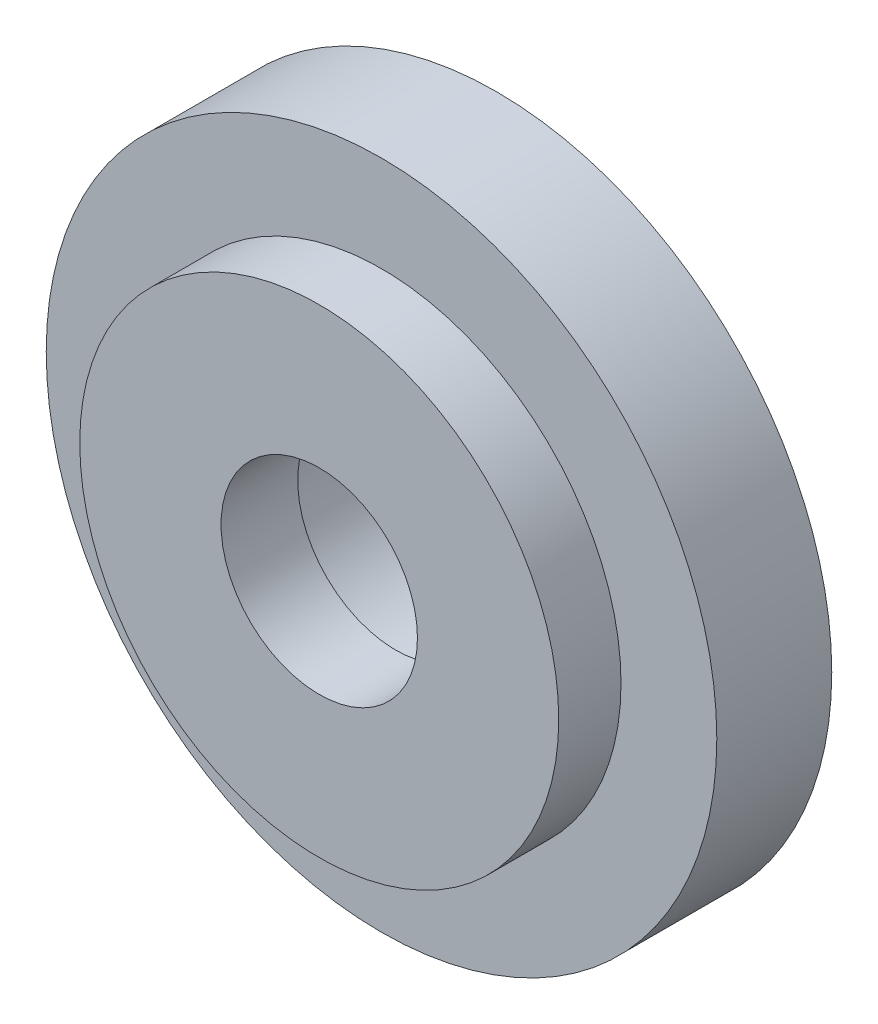
ISO-10303-21;
HEADER;
FILE_DESCRIPTION(('STEP AP214'),'2;1');
FILE_NAME('part.step','',(''),(''),'','','');
FILE_SCHEMA(('AUTOMOTIVE_DESIGN { 1 0 10303 214 1 1 1 1 }'));
ENDSEC;
DATA;
#1=APPLICATION_CONTEXT('core data for automotive mechanical design processes');
#2=APPLICATION_PROTOCOL_DEFINITION('international standard','automotive_design',2000,#1);
#3=PRODUCT_CONTEXT('',#1,'mechanical');
#4=PRODUCT('Part','Part','',(#3));
#5=PRODUCT_RELATED_PRODUCT_CATEGORY('part','',(#4));
#6=PRODUCT_DEFINITION_FORMATION('','',#4);
#7=PRODUCT_DEFINITION_CONTEXT('part definition',#1,'design');
#8=PRODUCT_DEFINITION('design','',#6,#7);
#9=PRODUCT_DEFINITION_SHAPE('','',#8);
#10=(LENGTH_UNIT() NAMED_UNIT(*) SI_UNIT(.MILLI.,.METRE.));
#11=(NAMED_UNIT(*) PLANE_ANGLE_UNIT() SI_UNIT($,.RADIAN.));
#12=(NAMED_UNIT(*) SI_UNIT($,.STERADIAN.) SOLID_ANGLE_UNIT());
#13=UNCERTAINTY_MEASURE_WITH_UNIT(LENGTH_MEASURE(1.E-05),#10,'distance_accuracy_value','');
#14=(GEOMETRIC_REPRESENTATION_CONTEXT(3) GLOBAL_UNCERTAINTY_ASSIGNED_CONTEXT((#13)) GLOBAL_UNIT_ASSIGNED_CONTEXT((#10,
#11,#12)) REPRESENTATION_CONTEXT('',''));
#15=CARTESIAN_POINT('',(0.,0.,0.));
#16=DIRECTION('',(0.,0.,1.));
#17=DIRECTION('',(1.,0.,0.));
#18=AXIS2_PLACEMENT_3D('',#15,#16,#17);
#19=CARTESIAN_POINT('',(0.,0.,12.7));
#20=DIRECTION('',(0.,0.,-1.));
#21=DIRECTION('',(-1.,0.,0.));
#22=AXIS2_PLACEMENT_3D('',#19,#20,#21);
#23=CYLINDRICAL_SURFACE('',#22,12.7);
#24=CARTESIAN_POINT('',(0.,0.,9.398));
#25=DIRECTION('',(0.,0.,1.));
#26=DIRECTION('',(1.,0.,0.));
#27=AXIS2_PLACEMENT_3D('',#24,#25,#26);
#28=CIRCLE('',#27,12.7);
#29=CARTESIAN_POINT('',(12.7,0.,9.398));
#30=VERTEX_POINT('',#29);
#31=EDGE_CURVE('E54',#30,#30,#28,.T.);
#32=ORIENTED_EDGE('',*,*,#31,.T.);
#33=EDGE_LOOP('',(#32));
#34=FACE_BOUND('',#33,.T.);
#35=CARTESIAN_POINT('',(0.,0.,12.7));
#36=DIRECTION('',(0.,0.,1.));
#37=DIRECTION('',(1.,0.,0.));
#38=AXIS2_PLACEMENT_3D('',#35,#36,#37);
#39=CIRCLE('',#38,12.7);
#40=CARTESIAN_POINT('',(12.7,0.,12.7));
#41=VERTEX_POINT('',#40);
#42=EDGE_CURVE('E46',#41,#41,#39,.T.);
#43=ORIENTED_EDGE('',*,*,#42,.F.);
#44=EDGE_LOOP('',(#43));
#45=FACE_BOUND('',#44,.T.);
#46=ADVANCED_FACE('F39',(#34,#45),#23,.T.);
#47=CARTESIAN_POINT('',(0.,0.,12.7));
#48=DIRECTION('',(0.,0.,1.));
#49=DIRECTION('',(1.,0.,0.));
#50=AXIS2_PLACEMENT_3D('',#47,#48,#49);
#51=PLANE('',#50);
#52=CARTESIAN_POINT('',(0.,0.,12.7));
#53=DIRECTION('',(0.,0.,1.));
#54=DIRECTION('',(1.,0.,0.));
#55=AXIS2_PLACEMENT_3D('',#52,#53,#54);
#56=CIRCLE('',#55,5.207);
#57=CARTESIAN_POINT('',(5.207,0.,12.7));
#58=VERTEX_POINT('',#57);
#59=EDGE_CURVE('E80',#58,#58,#56,.T.);
#60=ORIENTED_EDGE('',*,*,#59,.F.);
#61=EDGE_LOOP('',(#60));
#62=FACE_BOUND('',#61,.T.);
#63=ORIENTED_EDGE('',*,*,#42,.T.);
#64=EDGE_LOOP('',(#63));
#65=FACE_BOUND('',#64,.T.);
#66=ADVANCED_FACE('F100',(#62,#65),#51,.T.);
#67=CARTESIAN_POINT('',(0.,0.,9.398));
#68=DIRECTION('',(0.,0.,-1.));
#69=DIRECTION('',(-1.,0.,0.));
#70=AXIS2_PLACEMENT_3D('',#67,#68,#69);
#71=CYLINDRICAL_SURFACE('',#70,17.78);
#72=CARTESIAN_POINT('',(0.,0.,9.398));
#73=DIRECTION('',(0.,0.,1.));
#74=DIRECTION('',(1.,0.,0.));
#75=AXIS2_PLACEMENT_3D('',#72,#73,#74);
#76=CIRCLE('',#75,17.78);
#77=CARTESIAN_POINT('',(-17.78,0.,9.398));
#78=VERTEX_POINT('',#77);
#79=EDGE_CURVE('E56',#78,#78,#76,.T.);
#80=CARTESIAN_POINT('',(0.,0.,3.302));
#81=DIRECTION('',(0.,0.,1.));
#82=DIRECTION('',(1.,0.,0.));
#83=AXIS2_PLACEMENT_3D('',#80,#81,#82);
#84=CIRCLE('',#83,17.78);
#85=CARTESIAN_POINT('',(-17.78,0.,3.302));
#86=VERTEX_POINT('',#85);
#87=EDGE_CURVE('E61',#86,#86,#84,.T.);
#88=CARTESIAN_POINT('',(-17.78,0.,9.398));
#89=CARTESIAN_POINT('',(-17.78,0.,9.3345));
#90=CARTESIAN_POINT('',(-17.78,0.,9.271));
#91=CARTESIAN_POINT('',(-17.78,0.,9.144));
#92=CARTESIAN_POINT('',(-17.78,0.,9.0805));
#93=CARTESIAN_POINT('',(-17.78,0.,8.9535));
#94=CARTESIAN_POINT('',(-17.78,0.,8.89));
#95=CARTESIAN_POINT('',(-17.78,0.,8.763));
#96=CARTESIAN_POINT('',(-17.78,0.,8.6995));
#97=CARTESIAN_POINT('',(-17.78,0.,8.5725));
#98=CARTESIAN_POINT('',(-17.78,0.,8.509));
#99=CARTESIAN_POINT('',(-17.78,0.,8.382));
#100=CARTESIAN_POINT('',(-17.78,0.,8.3185));
#101=CARTESIAN_POINT('',(-17.78,0.,8.1915));
#102=CARTESIAN_POINT('',(-17.78,0.,8.128));
#103=CARTESIAN_POINT('',(-17.78,0.,8.001));
#104=CARTESIAN_POINT('',(-17.78,0.,7.9375));
#105=CARTESIAN_POINT('',(-17.78,0.,7.8105));
#106=CARTESIAN_POINT('',(-17.78,0.,7.747));
#107=CARTESIAN_POINT('',(-17.78,0.,7.62));
#108=CARTESIAN_POINT('',(-17.78,0.,7.5565));
#109=CARTESIAN_POINT('',(-17.78,0.,7.4295));
#110=CARTESIAN_POINT('',(-17.78,0.,7.366));
#111=CARTESIAN_POINT('',(-17.78,0.,7.239));
#112=CARTESIAN_POINT('',(-17.78,0.,7.1755));
#113=CARTESIAN_POINT('',(-17.78,0.,7.0485));
#114=CARTESIAN_POINT('',(-17.78,0.,6.985));
#115=CARTESIAN_POINT('',(-17.78,0.,6.858));
#116=CARTESIAN_POINT('',(-17.78,0.,6.7945));
#117=CARTESIAN_POINT('',(-17.78,0.,6.6675));
#118=CARTESIAN_POINT('',(-17.78,0.,6.604));
#119=CARTESIAN_POINT('',(-17.78,0.,6.477));
#120=CARTESIAN_POINT('',(-17.78,0.,6.4135));
#121=CARTESIAN_POINT('',(-17.78,0.,6.2865));
#122=CARTESIAN_POINT('',(-17.78,0.,6.223));
#123=CARTESIAN_POINT('',(-17.78,0.,6.096));
#124=CARTESIAN_POINT('',(-17.78,0.,6.0325));
#125=CARTESIAN_POINT('',(-17.78,0.,5.9055));
#126=CARTESIAN_POINT('',(-17.78,0.,5.842));
#127=CARTESIAN_POINT('',(-17.78,0.,5.715));
#128=CARTESIAN_POINT('',(-17.78,0.,5.6515));
#129=CARTESIAN_POINT('',(-17.78,0.,5.5245));
#130=CARTESIAN_POINT('',(-17.78,0.,5.461));
#131=CARTESIAN_POINT('',(-17.78,0.,5.334));
#132=CARTESIAN_POINT('',(-17.78,0.,5.2705));
#133=CARTESIAN_POINT('',(-17.78,0.,5.1435));
#134=CARTESIAN_POINT('',(-17.78,0.,5.08));
#135=CARTESIAN_POINT('',(-17.78,0.,4.953));
#136=CARTESIAN_POINT('',(-17.78,0.,4.8895));
#137=CARTESIAN_POINT('',(-17.78,0.,4.7625));
#138=CARTESIAN_POINT('',(-17.78,0.,4.699));
#139=CARTESIAN_POINT('',(-17.78,0.,4.572));
#140=CARTESIAN_POINT('',(-17.78,0.,4.5085));
#141=CARTESIAN_POINT('',(-17.78,0.,4.3815));
#142=CARTESIAN_POINT('',(-17.78,0.,4.318));
#143=CARTESIAN_POINT('',(-17.78,0.,4.191));
#144=CARTESIAN_POINT('',(-17.78,0.,4.1275));
#145=CARTESIAN_POINT('',(-17.78,0.,4.0005));
#146=CARTESIAN_POINT('',(-17.78,0.,3.937));
#147=CARTESIAN_POINT('',(-17.78,0.,3.81));
#148=CARTESIAN_POINT('',(-17.78,0.,3.7465));
#149=CARTESIAN_POINT('',(-17.78,0.,3.6195));
#150=CARTESIAN_POINT('',(-17.78,0.,3.556));
#151=CARTESIAN_POINT('',(-17.78,0.,3.429));
#152=CARTESIAN_POINT('',(-17.78,0.,3.3655));
#153=CARTESIAN_POINT('',(-17.78,0.,3.302));
#154=B_SPLINE_CURVE_WITH_KNOTS('',3,(#88,#89,#90,#91,#92,#93,#94,#95,#96,#97,#98,#99,#100,#101,
#102,#103,#104,#105,#106,#107,#108,#109,#110,#111,#112,#113,#114,#115,#116,#117,#118,#119,#120,
#121,#122,#123,#124,#125,#126,#127,#128,#129,#130,#131,#132,#133,#134,#135,#136,#137,#138,#139,
#140,#141,#142,#143,#144,#145,#146,#147,#148,#149,#150,#151,#152,#153),.UNSPECIFIED.,.F.,.F.,(4,
2,2,2,2,2,2,2,2,2,2,2,2,2,2,2,2,2,2,2,2,2,2,2,2,2,2,2,2,2,2,2,4),(0.,0.1905,0.380999999999999,
0.571499999999999,0.761999999999999,0.952499999999998,1.143,1.3335,1.524,1.7145,1.905,2.0955,
2.286,2.4765,2.667,2.8575,3.048,3.2385,3.429,3.6195,3.81,4.0005,4.191,4.3815,4.572,4.7625,4.953,
5.1435,5.334,5.5245,5.715,5.9055,6.096),.UNSPECIFIED.);
#155=EDGE_CURVE('BSEAM106',#78,#86,#154,.T.);
#156=ORIENTED_EDGE('',*,*,#79,.F.);
#157=ORIENTED_EDGE('',*,*,#87,.T.);
#158=ORIENTED_EDGE('',*,*,#155,.T.);
#159=ORIENTED_EDGE('',*,*,#155,.F.);
#160=EDGE_LOOP('',(#156,#158,#157,#159));
#161=FACE_BOUND('',#160,.T.);
#162=ADVANCED_FACE('F106',(#161),#71,.T.);
#163=CARTESIAN_POINT('',(0.,0.,9.398));
#164=DIRECTION('',(0.,0.,1.));
#165=DIRECTION('',(1.,0.,0.));
#166=AXIS2_PLACEMENT_3D('',#163,#164,#165);
#167=PLANE('',#166);
#168=ORIENTED_EDGE('',*,*,#31,.F.);
#169=EDGE_LOOP('',(#168));
#170=FACE_BOUND('',#169,.T.);
#171=ORIENTED_EDGE('',*,*,#79,.T.);
#172=EDGE_LOOP('',(#171));
#173=FACE_BOUND('',#172,.T.);
#174=ADVANCED_FACE('F130',(#170,#173),#167,.T.);
#175=CARTESIAN_POINT('',(0.,0.,3.302));
#176=DIRECTION('',(0.,0.,1.));
#177=DIRECTION('',(1.,0.,0.));
#178=AXIS2_PLACEMENT_3D('',#175,#176,#177);
#179=PLANE('',#178);
#180=CARTESIAN_POINT('',(0.,0.,3.302));
#181=DIRECTION('',(0.,0.,1.));
#182=DIRECTION('',(1.,0.,0.));
#183=AXIS2_PLACEMENT_3D('',#180,#181,#182);
#184=CIRCLE('',#183,12.7);
#185=CARTESIAN_POINT('',(12.7,0.,3.302));
#186=VERTEX_POINT('',#185);
#187=EDGE_CURVE('E10',#186,#186,#184,.T.);
#188=ORIENTED_EDGE('',*,*,#187,.T.);
#189=EDGE_LOOP('',(#188));
#190=FACE_BOUND('',#189,.T.);
#191=ORIENTED_EDGE('',*,*,#87,.F.);
#192=EDGE_LOOP('',(#191));
#193=FACE_BOUND('',#192,.T.);
#194=ADVANCED_FACE('F123',(#190,#193),#179,.F.);
#195=CARTESIAN_POINT('',(0.,0.,0.));
#196=DIRECTION('',(0.,0.,1.));
#197=DIRECTION('',(1.,0.,0.));
#198=AXIS2_PLACEMENT_3D('',#195,#196,#197);
#199=PLANE('',#198);
#200=CARTESIAN_POINT('',(0.,0.,0.));
#201=DIRECTION('',(0.,0.,-1.));
#202=DIRECTION('',(-1.,0.,0.));
#203=AXIS2_PLACEMENT_3D('',#200,#201,#202);
#204=CIRCLE('',#203,6.731);
#205=CARTESIAN_POINT('',(-6.731,0.,0.));
#206=VERTEX_POINT('',#205);
#207=EDGE_CURVE('E77',#206,#206,#204,.T.);
#208=ORIENTED_EDGE('',*,*,#207,.F.);
#209=EDGE_LOOP('',(#208));
#210=FACE_BOUND('',#209,.T.);
#211=CARTESIAN_POINT('',(0.,0.,0.));
#212=DIRECTION('',(0.,0.,1.));
#213=DIRECTION('',(1.,0.,0.));
#214=AXIS2_PLACEMENT_3D('',#211,#212,#213);
#215=CIRCLE('',#214,12.7);
#216=CARTESIAN_POINT('',(12.7,0.,0.));
#217=VERTEX_POINT('',#216);
#218=EDGE_CURVE('E51',#217,#217,#215,.T.);
#219=ORIENTED_EDGE('',*,*,#218,.F.);
#220=EDGE_LOOP('',(#219));
#221=FACE_BOUND('',#220,.T.);
#222=ADVANCED_FACE('F112',(#210,#221),#199,.F.);
#223=ORIENTED_EDGE('',*,*,#218,.T.);
#224=EDGE_LOOP('',(#223));
#225=FACE_BOUND('',#224,.T.);
#226=ORIENTED_EDGE('',*,*,#187,.F.);
#227=EDGE_LOOP('',(#226));
#228=FACE_BOUND('',#227,.T.);
#229=ADVANCED_FACE('F101',(#225,#228),#23,.T.);
#230=CARTESIAN_POINT('',(0.,0.,4.064));
#231=DIRECTION('',(0.,0.,1.));
#232=DIRECTION('',(1.,0.,0.));
#233=AXIS2_PLACEMENT_3D('',#230,#231,#232);
#234=PLANE('',#233);
#235=CARTESIAN_POINT('',(0.,0.,4.064));
#236=DIRECTION('',(0.,0.,1.));
#237=DIRECTION('',(1.,0.,0.));
#238=AXIS2_PLACEMENT_3D('',#235,#236,#237);
#239=CIRCLE('',#238,6.477);
#240=CARTESIAN_POINT('',(6.477,0.,4.064));
#241=VERTEX_POINT('',#240);
#242=EDGE_CURVE('E71',#241,#241,#239,.T.);
#243=ORIENTED_EDGE('',*,*,#242,.T.);
#244=EDGE_LOOP('',(#243));
#245=FACE_BOUND('',#244,.T.);
#246=CARTESIAN_POINT('',(0.,0.,4.064));
#247=DIRECTION('',(0.,0.,1.));
#248=DIRECTION('',(1.,0.,0.));
#249=AXIS2_PLACEMENT_3D('',#246,#247,#248);
#250=CIRCLE('',#249,6.731);
#251=CARTESIAN_POINT('',(6.731,0.,4.064));
#252=VERTEX_POINT('',#251);
#253=EDGE_CURVE('E74',#252,#252,#250,.F.);
#254=ORIENTED_EDGE('',*,*,#253,.T.);
#255=EDGE_LOOP('',(#254));
#256=FACE_BOUND('',#255,.T.);
#257=ADVANCED_FACE('F111',(#245,#256),#234,.F.);
#258=CARTESIAN_POINT('',(0.,0.,23.1021429766666));
#259=DIRECTION('',(0.,0.,-1.));
#260=DIRECTION('',(-1.,0.,0.));
#261=AXIS2_PLACEMENT_3D('',#258,#259,#260);
#262=CYLINDRICAL_SURFACE('',#261,6.731);
#263=ORIENTED_EDGE('',*,*,#207,.T.);
#264=EDGE_LOOP('',(#263));
#265=FACE_BOUND('',#264,.T.);
#266=ORIENTED_EDGE('',*,*,#253,.F.);
#267=EDGE_LOOP('',(#266));
#268=FACE_BOUND('',#267,.T.);
#269=ADVANCED_FACE('F119',(#265,#268),#262,.F.);
#270=CARTESIAN_POINT('',(0.,0.,4.064));
#271=DIRECTION('',(0.,0.,1.));
#272=DIRECTION('',(1.,0.,0.));
#273=AXIS2_PLACEMENT_3D('',#270,#271,#272);
#274=CYLINDRICAL_SURFACE('',#273,6.477);
#275=ORIENTED_EDGE('',*,*,#242,.F.);
#276=EDGE_LOOP('',(#275));
#277=FACE_BOUND('',#276,.T.);
#278=CARTESIAN_POINT('',(0.,0.,8.636));
#279=DIRECTION('',(0.,0.,1.));
#280=DIRECTION('',(1.,0.,0.));
#281=AXIS2_PLACEMENT_3D('',#278,#279,#280);
#282=CIRCLE('',#281,6.477);
#283=CARTESIAN_POINT('',(6.477,0.,8.636));
#284=VERTEX_POINT('',#283);
#285=EDGE_CURVE('E66',#284,#284,#282,.T.);
#286=ORIENTED_EDGE('',*,*,#285,.T.);
#287=EDGE_LOOP('',(#286));
#288=FACE_BOUND('',#287,.T.);
#289=ADVANCED_FACE('F96',(#277,#288),#274,.F.);
#290=CARTESIAN_POINT('',(0.,0.,8.636));
#291=DIRECTION('',(0.,0.,1.));
#292=DIRECTION('',(1.,0.,0.));
#293=AXIS2_PLACEMENT_3D('',#290,#291,#292);
#294=PLANE('',#293);
#295=CARTESIAN_POINT('',(0.,0.,8.636));
#296=DIRECTION('',(0.,0.,1.));
#297=DIRECTION('',(1.,0.,0.));
#298=AXIS2_PLACEMENT_3D('',#295,#296,#297);
#299=CIRCLE('',#298,5.207);
#300=CARTESIAN_POINT('',(5.207,0.,8.636));
#301=VERTEX_POINT('',#300);
#302=EDGE_CURVE('E42',#301,#301,#299,.T.);
#303=ORIENTED_EDGE('',*,*,#302,.T.);
#304=EDGE_LOOP('',(#303));
#305=FACE_BOUND('',#304,.T.);
#306=ORIENTED_EDGE('',*,*,#285,.F.);
#307=EDGE_LOOP('',(#306));
#308=FACE_BOUND('',#307,.T.);
#309=ADVANCED_FACE('F87',(#305,#308),#294,.F.);
#310=CARTESIAN_POINT('',(0.,0.,0.));
#311=DIRECTION('',(0.,0.,1.));
#312=DIRECTION('',(1.,0.,0.));
#313=AXIS2_PLACEMENT_3D('',#310,#311,#312);
#314=CYLINDRICAL_SURFACE('',#313,5.207);
#315=ORIENTED_EDGE('',*,*,#59,.T.);
#316=EDGE_LOOP('',(#315));
#317=FACE_BOUND('',#316,.T.);
#318=ORIENTED_EDGE('',*,*,#302,.F.);
#319=EDGE_LOOP('',(#318));
#320=FACE_BOUND('',#319,.T.);
#321=ADVANCED_FACE('F90',(#317,#320),#314,.F.);
#322=CLOSED_SHELL('',(#46,#66,#162,#174,#194,#222,#229,#257,#269,#289,#309,#321));
#323=MANIFOLD_SOLID_BREP('B2',#322);
#324=ADVANCED_BREP_SHAPE_REPRESENTATION('',(#18,#323),#14);
#325=SHAPE_DEFINITION_REPRESENTATION(#9,#324);
ENDSEC;
END-ISO-10303-21;
